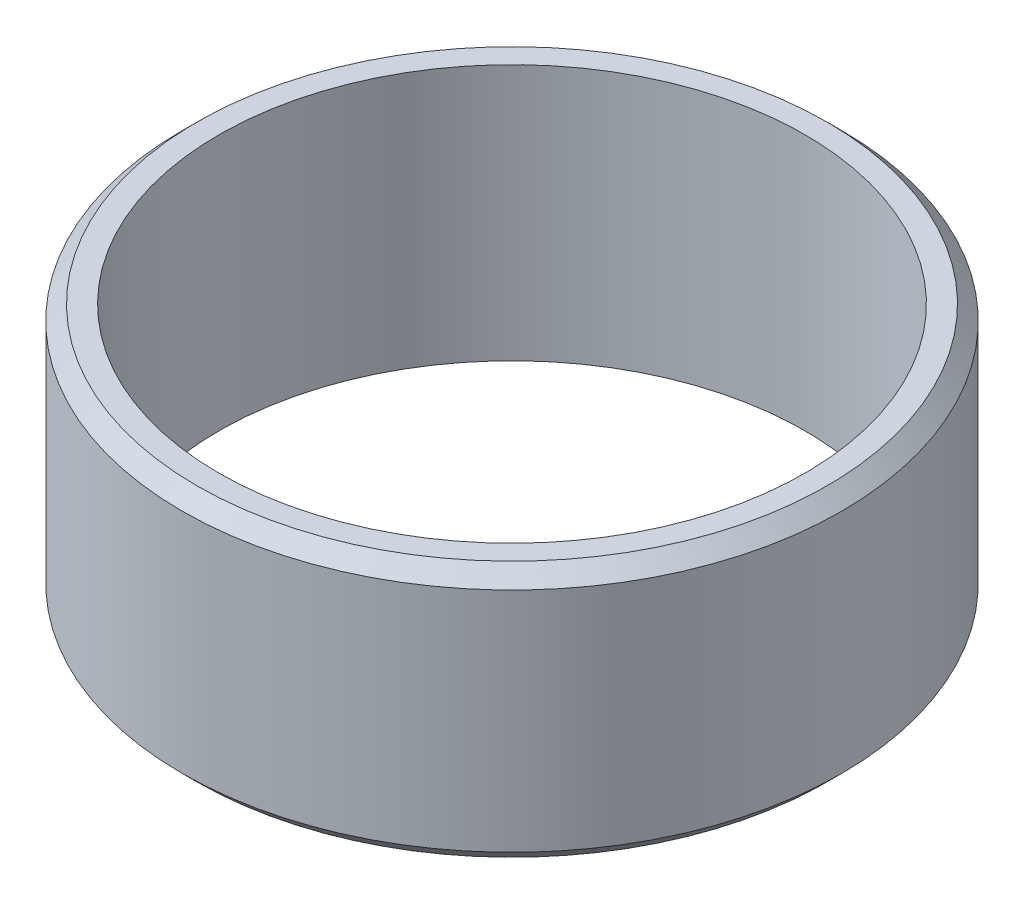
ISO-10303-21;
HEADER;
FILE_DESCRIPTION(('STEP AP214'),'2;1');
FILE_NAME('part.step','',(''),(''),'','','');
FILE_SCHEMA(('AUTOMOTIVE_DESIGN { 1 0 10303 214 1 1 1 1 }'));
ENDSEC;
DATA;
#1=APPLICATION_CONTEXT('core data for automotive mechanical design processes');
#2=APPLICATION_PROTOCOL_DEFINITION('international standard','automotive_design',2000,#1);
#3=PRODUCT_CONTEXT('',#1,'mechanical');
#4=PRODUCT('Part','Part','',(#3));
#5=PRODUCT_RELATED_PRODUCT_CATEGORY('part','',(#4));
#6=PRODUCT_DEFINITION_FORMATION('','',#4);
#7=PRODUCT_DEFINITION_CONTEXT('part definition',#1,'design');
#8=PRODUCT_DEFINITION('design','',#6,#7);
#9=PRODUCT_DEFINITION_SHAPE('','',#8);
#10=(LENGTH_UNIT() NAMED_UNIT(*) SI_UNIT(.MILLI.,.METRE.));
#11=(NAMED_UNIT(*) PLANE_ANGLE_UNIT() SI_UNIT($,.RADIAN.));
#12=(NAMED_UNIT(*) SI_UNIT($,.STERADIAN.) SOLID_ANGLE_UNIT());
#13=UNCERTAINTY_MEASURE_WITH_UNIT(LENGTH_MEASURE(1.E-05),#10,'distance_accuracy_value','');
#14=(GEOMETRIC_REPRESENTATION_CONTEXT(3) GLOBAL_UNCERTAINTY_ASSIGNED_CONTEXT((#13)) GLOBAL_UNIT_ASSIGNED_CONTEXT((#10,
#11,#12)) REPRESENTATION_CONTEXT('',''));
#15=CARTESIAN_POINT('',(0.,0.,0.));
#16=DIRECTION('',(0.,0.,1.));
#17=DIRECTION('',(1.,0.,0.));
#18=AXIS2_PLACEMENT_3D('',#15,#16,#17);
#19=CARTESIAN_POINT('',(0.,3.5,0.));
#20=DIRECTION('',(0.,1.,0.));
#21=DIRECTION('',(0.,0.,1.));
#22=AXIS2_PLACEMENT_3D('',#19,#20,#21);
#23=PLANE('',#22);
#24=CARTESIAN_POINT('',(0.,3.5,0.));
#25=DIRECTION('',(0.,1.,0.));
#26=DIRECTION('',(0.,0.,1.));
#27=AXIS2_PLACEMENT_3D('',#24,#25,#26);
#28=CIRCLE('',#27,4.3);
#29=CARTESIAN_POINT('',(0.,3.5,-4.3));
#30=VERTEX_POINT('',#29);
#31=EDGE_CURVE('E68',#30,#30,#28,.T.);
#32=ORIENTED_EDGE('',*,*,#31,.T.);
#33=EDGE_LOOP('',(#32));
#34=FACE_BOUND('',#33,.T.);
#35=CARTESIAN_POINT('',(0.,3.5,0.));
#36=DIRECTION('',(0.,1.,0.));
#37=DIRECTION('',(0.,0.,1.));
#38=AXIS2_PLACEMENT_3D('',#35,#36,#37);
#39=CIRCLE('',#38,4.);
#40=CARTESIAN_POINT('',(0.,3.5,4.));
#41=VERTEX_POINT('',#40);
#42=EDGE_CURVE('E73',#41,#41,#39,.T.);
#43=ORIENTED_EDGE('',*,*,#42,.F.);
#44=EDGE_LOOP('',(#43));
#45=FACE_BOUND('',#44,.T.);
#46=ADVANCED_FACE('F47',(#34,#45),#23,.T.);
#47=CARTESIAN_POINT('',(0.,0.,0.));
#48=DIRECTION('',(0.,1.,0.));
#49=DIRECTION('',(0.,0.,1.));
#50=AXIS2_PLACEMENT_3D('',#47,#48,#49);
#51=PLANE('',#50);
#52=CARTESIAN_POINT('',(0.,0.,0.));
#53=DIRECTION('',(0.,1.,0.));
#54=DIRECTION('',(0.,0.,1.));
#55=AXIS2_PLACEMENT_3D('',#52,#53,#54);
#56=CIRCLE('',#55,4.3);
#57=CARTESIAN_POINT('',(0.,0.,4.3));
#58=VERTEX_POINT('',#57);
#59=EDGE_CURVE('E10',#58,#58,#56,.F.);
#60=ORIENTED_EDGE('',*,*,#59,.T.);
#61=EDGE_LOOP('',(#60));
#62=FACE_BOUND('',#61,.T.);
#63=CARTESIAN_POINT('',(0.,0.,0.));
#64=DIRECTION('',(0.,1.,0.));
#65=DIRECTION('',(0.,0.,1.));
#66=AXIS2_PLACEMENT_3D('',#63,#64,#65);
#67=CIRCLE('',#66,4.);
#68=CARTESIAN_POINT('',(0.,0.,4.));
#69=VERTEX_POINT('',#68);
#70=EDGE_CURVE('E74',#69,#69,#67,.T.);
#71=ORIENTED_EDGE('',*,*,#70,.T.);
#72=EDGE_LOOP('',(#71));
#73=FACE_BOUND('',#72,.T.);
#74=ADVANCED_FACE('F85',(#62,#73),#51,.F.);
#75=CARTESIAN_POINT('',(0.,3.5,0.));
#76=DIRECTION('',(0.,-1.,0.));
#77=DIRECTION('',(0.,0.,-1.));
#78=AXIS2_PLACEMENT_3D('',#75,#76,#77);
#79=CYLINDRICAL_SURFACE('',#78,4.5);
#80=CARTESIAN_POINT('',(0.,3.3,0.));
#81=DIRECTION('',(0.,1.,0.));
#82=DIRECTION('',(0.,0.,1.));
#83=AXIS2_PLACEMENT_3D('',#80,#81,#82);
#84=CIRCLE('',#83,4.5);
#85=CARTESIAN_POINT('',(0.,3.3,-4.5));
#86=VERTEX_POINT('',#85);
#87=EDGE_CURVE('E56',#86,#86,#84,.F.);
#88=ORIENTED_EDGE('',*,*,#87,.T.);
#89=EDGE_LOOP('',(#88));
#90=FACE_BOUND('',#89,.T.);
#91=CARTESIAN_POINT('',(0.,0.199999999999999,0.));
#92=DIRECTION('',(0.,1.,0.));
#93=DIRECTION('',(0.,0.,1.));
#94=AXIS2_PLACEMENT_3D('',#91,#92,#93);
#95=CIRCLE('',#94,4.5);
#96=CARTESIAN_POINT('',(0.,0.199999999999999,4.5));
#97=VERTEX_POINT('',#96);
#98=EDGE_CURVE('E62',#97,#97,#95,.T.);
#99=ORIENTED_EDGE('',*,*,#98,.T.);
#100=EDGE_LOOP('',(#99));
#101=FACE_BOUND('',#100,.T.);
#102=ADVANCED_FACE('F91',(#90,#101),#79,.T.);
#103=CARTESIAN_POINT('',(0.,3.5,0.));
#104=DIRECTION('',(0.,-1.,0.));
#105=DIRECTION('',(0.,0.,-1.));
#106=AXIS2_PLACEMENT_3D('',#103,#104,#105);
#107=CYLINDRICAL_SURFACE('',#106,4.);
#108=ORIENTED_EDGE('',*,*,#42,.T.);
#109=EDGE_LOOP('',(#108));
#110=FACE_BOUND('',#109,.T.);
#111=ORIENTED_EDGE('',*,*,#70,.F.);
#112=EDGE_LOOP('',(#111));
#113=FACE_BOUND('',#112,.T.);
#114=ADVANCED_FACE('F81',(#110,#113),#107,.F.);
#115=CARTESIAN_POINT('',(0.,3.5,0.));
#116=DIRECTION('',(0.,-1.,0.));
#117=DIRECTION('',(0.,0.,-1.));
#118=AXIS2_PLACEMENT_3D('',#115,#116,#117);
#119=CONICAL_SURFACE('',#118,4.3,0.785398163397448);
#120=CARTESIAN_POINT('',(0.,3.3,-4.5));
#121=CARTESIAN_POINT('',(0.,3.30208333333333,-4.49791666666667));
#122=CARTESIAN_POINT('',(0.,3.30416666666667,-4.49583333333333));
#123=CARTESIAN_POINT('',(0.,3.30833333333333,-4.49166666666667));
#124=CARTESIAN_POINT('',(0.,3.31041666666667,-4.48958333333333));
#125=CARTESIAN_POINT('',(0.,3.31458333333333,-4.48541666666667));
#126=CARTESIAN_POINT('',(0.,3.31666666666667,-4.48333333333333));
#127=CARTESIAN_POINT('',(0.,3.32083333333333,-4.47916666666667));
#128=CARTESIAN_POINT('',(0.,3.32291666666667,-4.47708333333333));
#129=CARTESIAN_POINT('',(0.,3.32708333333333,-4.47291666666667));
#130=CARTESIAN_POINT('',(0.,3.32916666666667,-4.47083333333333));
#131=CARTESIAN_POINT('',(0.,3.33333333333333,-4.46666666666667));
#132=CARTESIAN_POINT('',(0.,3.33541666666667,-4.46458333333333));
#133=CARTESIAN_POINT('',(0.,3.33958333333333,-4.46041666666667));
#134=CARTESIAN_POINT('',(0.,3.34166666666667,-4.45833333333333));
#135=CARTESIAN_POINT('',(0.,3.34583333333333,-4.45416666666667));
#136=CARTESIAN_POINT('',(0.,3.34791666666667,-4.45208333333333));
#137=CARTESIAN_POINT('',(0.,3.35208333333333,-4.44791666666667));
#138=CARTESIAN_POINT('',(0.,3.35416666666667,-4.44583333333333));
#139=CARTESIAN_POINT('',(0.,3.35833333333333,-4.44166666666667));
#140=CARTESIAN_POINT('',(0.,3.36041666666667,-4.43958333333333));
#141=CARTESIAN_POINT('',(0.,3.36458333333333,-4.43541666666667));
#142=CARTESIAN_POINT('',(0.,3.36666666666667,-4.43333333333333));
#143=CARTESIAN_POINT('',(0.,3.37083333333333,-4.42916666666667));
#144=CARTESIAN_POINT('',(0.,3.37291666666667,-4.42708333333333));
#145=CARTESIAN_POINT('',(0.,3.37708333333333,-4.42291666666667));
#146=CARTESIAN_POINT('',(0.,3.37916666666667,-4.42083333333333));
#147=CARTESIAN_POINT('',(0.,3.38333333333333,-4.41666666666667));
#148=CARTESIAN_POINT('',(0.,3.38541666666667,-4.41458333333333));
#149=CARTESIAN_POINT('',(0.,3.38958333333333,-4.41041666666667));
#150=CARTESIAN_POINT('',(0.,3.39166666666667,-4.40833333333333));
#151=CARTESIAN_POINT('',(0.,3.39583333333333,-4.40416666666667));
#152=CARTESIAN_POINT('',(0.,3.39791666666667,-4.40208333333333));
#153=CARTESIAN_POINT('',(0.,3.40208333333333,-4.39791666666667));
#154=CARTESIAN_POINT('',(0.,3.40416666666667,-4.39583333333333));
#155=CARTESIAN_POINT('',(0.,3.40833333333333,-4.39166666666667));
#156=CARTESIAN_POINT('',(0.,3.41041666666667,-4.38958333333333));
#157=CARTESIAN_POINT('',(0.,3.41458333333333,-4.38541666666667));
#158=CARTESIAN_POINT('',(0.,3.41666666666667,-4.38333333333333));
#159=CARTESIAN_POINT('',(0.,3.42083333333333,-4.37916666666667));
#160=CARTESIAN_POINT('',(0.,3.42291666666667,-4.37708333333333));
#161=CARTESIAN_POINT('',(0.,3.42708333333333,-4.37291666666667));
#162=CARTESIAN_POINT('',(0.,3.42916666666667,-4.37083333333333));
#163=CARTESIAN_POINT('',(0.,3.43333333333333,-4.36666666666667));
#164=CARTESIAN_POINT('',(0.,3.43541666666667,-4.36458333333333));
#165=CARTESIAN_POINT('',(0.,3.43958333333333,-4.36041666666667));
#166=CARTESIAN_POINT('',(0.,3.44166666666667,-4.35833333333333));
#167=CARTESIAN_POINT('',(0.,3.44583333333333,-4.35416666666667));
#168=CARTESIAN_POINT('',(0.,3.44791666666667,-4.35208333333333));
#169=CARTESIAN_POINT('',(0.,3.45208333333333,-4.34791666666667));
#170=CARTESIAN_POINT('',(0.,3.45416666666667,-4.34583333333333));
#171=CARTESIAN_POINT('',(0.,3.45833333333333,-4.34166666666667));
#172=CARTESIAN_POINT('',(0.,3.46041666666667,-4.33958333333333));
#173=CARTESIAN_POINT('',(0.,3.46458333333333,-4.33541666666667));
#174=CARTESIAN_POINT('',(0.,3.46666666666667,-4.33333333333333));
#175=CARTESIAN_POINT('',(0.,3.47083333333333,-4.32916666666667));
#176=CARTESIAN_POINT('',(0.,3.47291666666667,-4.32708333333333));
#177=CARTESIAN_POINT('',(0.,3.47708333333333,-4.32291666666667));
#178=CARTESIAN_POINT('',(0.,3.47916666666667,-4.32083333333333));
#179=CARTESIAN_POINT('',(0.,3.48333333333333,-4.31666666666667));
#180=CARTESIAN_POINT('',(0.,3.48541666666667,-4.31458333333333));
#181=CARTESIAN_POINT('',(0.,3.48958333333333,-4.31041666666667));
#182=CARTESIAN_POINT('',(0.,3.49166666666667,-4.30833333333333));
#183=CARTESIAN_POINT('',(0.,3.49583333333333,-4.30416666666667));
#184=CARTESIAN_POINT('',(0.,3.49791666666667,-4.30208333333333));
#185=CARTESIAN_POINT('',(0.,3.5,-4.3));
#186=B_SPLINE_CURVE_WITH_KNOTS('',3,(#120,#121,#122,#123,#124,#125,#126,#127,#128,#129,#130,
#131,#132,#133,#134,#135,#136,#137,#138,#139,#140,#141,#142,#143,#144,#145,#146,#147,#148,#149,
#150,#151,#152,#153,#154,#155,#156,#157,#158,#159,#160,#161,#162,#163,#164,#165,#166,#167,#168,
#169,#170,#171,#172,#173,#174,#175,#176,#177,#178,#179,#180,#181,#182,#183,#184,#185),
.UNSPECIFIED.,.F.,.F.,(4,2,2,2,2,2,2,2,2,2,2,2,2,2,2,2,2,2,2,2,2,2,2,2,2,2,2,2,2,2,2,2,4),(0.,
0.00883883476483179,0.0176776695296633,0.0265165042944951,0.0353553390593272,0.0441941738241589,
0.0530330085889904,0.0618718433538225,0.0707106781186543,0.0795495128834864,0.0883883476483182,
0.0972271824131497,0.106066017177981,0.114904851942814,0.123743686707645,0.132582521472477,
0.141421356237309,0.150260191002141,0.159099025766973,0.167937860531805,0.176776695296636,
0.185615530061468,0.1944543648263,0.203293199591132,0.212132034355964,0.220970869120795,
0.229809703885627,0.238648538650459,0.247487373415291,0.256326208180123,0.265165042944954,
0.274003877709786,0.282842712474619),.UNSPECIFIED.);
#187=EDGE_CURVE('BSEAM97',#86,#30,#186,.T.);
#188=ORIENTED_EDGE('',*,*,#87,.F.);
#189=ORIENTED_EDGE('',*,*,#31,.F.);
#190=ORIENTED_EDGE('',*,*,#187,.T.);
#191=ORIENTED_EDGE('',*,*,#187,.F.);
#192=EDGE_LOOP('',(#188,#190,#189,#191));
#193=FACE_BOUND('',#192,.T.);
#194=ADVANCED_FACE('F97',(#193),#119,.T.);
#195=CARTESIAN_POINT('',(0.,0.199999999999999,0.));
#196=DIRECTION('',(0.,1.,0.));
#197=DIRECTION('',(0.,0.,1.));
#198=AXIS2_PLACEMENT_3D('',#195,#196,#197);
#199=CONICAL_SURFACE('',#198,4.5,0.785398163397453);
#200=ORIENTED_EDGE('',*,*,#59,.F.);
#201=EDGE_LOOP('',(#200));
#202=FACE_BOUND('',#201,.T.);
#203=ORIENTED_EDGE('',*,*,#98,.F.);
#204=EDGE_LOOP('',(#203));
#205=FACE_BOUND('',#204,.T.);
#206=ADVANCED_FACE('F50',(#202,#205),#199,.T.);
#207=CLOSED_SHELL('',(#46,#74,#102,#114,#194,#206));
#208=MANIFOLD_SOLID_BREP('B2',#207);
#209=ADVANCED_BREP_SHAPE_REPRESENTATION('',(#18,#208),#14);
#210=SHAPE_DEFINITION_REPRESENTATION(#9,#209);
ENDSEC;
END-ISO-10303-21;
